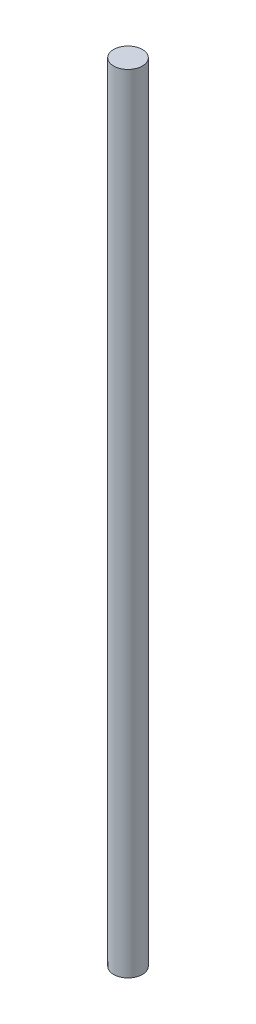
ISO-10303-21;
HEADER;
FILE_DESCRIPTION(('STEP AP214'),'2;1');
FILE_NAME('part.step','',(''),(''),'','','');
FILE_SCHEMA(('AUTOMOTIVE_DESIGN { 1 0 10303 214 1 1 1 1 }'));
ENDSEC;
DATA;
#1=APPLICATION_CONTEXT('core data for automotive mechanical design processes');
#2=APPLICATION_PROTOCOL_DEFINITION('international standard','automotive_design',2000,#1);
#3=PRODUCT_CONTEXT('',#1,'mechanical');
#4=PRODUCT('Part','Part','',(#3));
#5=PRODUCT_RELATED_PRODUCT_CATEGORY('part','',(#4));
#6=PRODUCT_DEFINITION_FORMATION('','',#4);
#7=PRODUCT_DEFINITION_CONTEXT('part definition',#1,'design');
#8=PRODUCT_DEFINITION('design','',#6,#7);
#9=PRODUCT_DEFINITION_SHAPE('','',#8);
#10=(LENGTH_UNIT() NAMED_UNIT(*) SI_UNIT(.MILLI.,.METRE.));
#11=(NAMED_UNIT(*) PLANE_ANGLE_UNIT() SI_UNIT($,.RADIAN.));
#12=(NAMED_UNIT(*) SI_UNIT($,.STERADIAN.) SOLID_ANGLE_UNIT());
#13=UNCERTAINTY_MEASURE_WITH_UNIT(LENGTH_MEASURE(1.E-05),#10,'distance_accuracy_value','');
#14=(GEOMETRIC_REPRESENTATION_CONTEXT(3) GLOBAL_UNCERTAINTY_ASSIGNED_CONTEXT((#13)) GLOBAL_UNIT_ASSIGNED_CONTEXT((#10,
#11,#12)) REPRESENTATION_CONTEXT('',''));
#15=CARTESIAN_POINT('',(0.,0.,0.));
#16=DIRECTION('',(0.,0.,1.));
#17=DIRECTION('',(1.,0.,0.));
#18=AXIS2_PLACEMENT_3D('',#15,#16,#17);
#19=CARTESIAN_POINT('',(0.,348.00032,0.));
#20=DIRECTION('',(0.,-1.,0.));
#21=DIRECTION('',(0.,0.,-1.));
#22=AXIS2_PLACEMENT_3D('',#19,#20,#21);
#23=CYLINDRICAL_SURFACE('',#22,6.35);
#24=CARTESIAN_POINT('',(0.,348.00032,0.));
#25=DIRECTION('',(0.,1.,0.));
#26=DIRECTION('',(0.,0.,1.));
#27=AXIS2_PLACEMENT_3D('',#24,#25,#26);
#28=CIRCLE('',#27,6.35);
#29=CARTESIAN_POINT('',(0.,348.00032,-6.35));
#30=VERTEX_POINT('',#29);
#31=EDGE_CURVE('E10',#30,#30,#28,.T.);
#32=CARTESIAN_POINT('',(0.,0.,0.));
#33=DIRECTION('',(0.,1.,0.));
#34=DIRECTION('',(0.,0.,1.));
#35=AXIS2_PLACEMENT_3D('',#32,#33,#34);
#36=CIRCLE('',#35,6.35);
#37=CARTESIAN_POINT('',(0.,0.,-6.35));
#38=VERTEX_POINT('',#37);
#39=EDGE_CURVE('E46',#38,#38,#36,.T.);
#40=CARTESIAN_POINT('',(0.,348.00032,-6.35));
#41=CARTESIAN_POINT('',(0.,344.375316666667,-6.35));
#42=CARTESIAN_POINT('',(0.,340.750313333333,-6.35));
#43=CARTESIAN_POINT('',(0.,333.500306666667,-6.35));
#44=CARTESIAN_POINT('',(0.,329.875303333333,-6.35));
#45=CARTESIAN_POINT('',(0.,322.625296666667,-6.35));
#46=CARTESIAN_POINT('',(0.,319.000293333333,-6.35));
#47=CARTESIAN_POINT('',(0.,311.750286666667,-6.35));
#48=CARTESIAN_POINT('',(0.,308.125283333333,-6.35));
#49=CARTESIAN_POINT('',(0.,300.875276666667,-6.35));
#50=CARTESIAN_POINT('',(0.,297.250273333333,-6.35));
#51=CARTESIAN_POINT('',(0.,290.000266666667,-6.35));
#52=CARTESIAN_POINT('',(0.,286.375263333333,-6.35));
#53=CARTESIAN_POINT('',(0.,279.125256666667,-6.35));
#54=CARTESIAN_POINT('',(0.,275.500253333333,-6.35));
#55=CARTESIAN_POINT('',(0.,268.250246666667,-6.35));
#56=CARTESIAN_POINT('',(0.,264.625243333333,-6.35));
#57=CARTESIAN_POINT('',(0.,257.375236666667,-6.35));
#58=CARTESIAN_POINT('',(0.,253.750233333333,-6.35));
#59=CARTESIAN_POINT('',(0.,246.500226666667,-6.35));
#60=CARTESIAN_POINT('',(0.,242.875223333333,-6.35));
#61=CARTESIAN_POINT('',(0.,235.625216666667,-6.35));
#62=CARTESIAN_POINT('',(0.,232.000213333333,-6.35));
#63=CARTESIAN_POINT('',(0.,224.750206666667,-6.35));
#64=CARTESIAN_POINT('',(0.,221.125203333333,-6.35));
#65=CARTESIAN_POINT('',(0.,213.875196666667,-6.35));
#66=CARTESIAN_POINT('',(0.,210.250193333333,-6.35));
#67=CARTESIAN_POINT('',(0.,203.000186666667,-6.35));
#68=CARTESIAN_POINT('',(0.,199.375183333333,-6.35));
#69=CARTESIAN_POINT('',(0.,192.125176666667,-6.35));
#70=CARTESIAN_POINT('',(0.,188.500173333333,-6.35));
#71=CARTESIAN_POINT('',(0.,181.250166666667,-6.35));
#72=CARTESIAN_POINT('',(0.,177.625163333333,-6.35));
#73=CARTESIAN_POINT('',(0.,170.375156666667,-6.35));
#74=CARTESIAN_POINT('',(0.,166.750153333333,-6.35));
#75=CARTESIAN_POINT('',(0.,159.500146666667,-6.35));
#76=CARTESIAN_POINT('',(0.,155.875143333333,-6.35));
#77=CARTESIAN_POINT('',(0.,148.625136666667,-6.35));
#78=CARTESIAN_POINT('',(0.,145.000133333333,-6.35));
#79=CARTESIAN_POINT('',(0.,137.750126666667,-6.35));
#80=CARTESIAN_POINT('',(0.,134.125123333333,-6.35));
#81=CARTESIAN_POINT('',(0.,126.875116666667,-6.35));
#82=CARTESIAN_POINT('',(0.,123.250113333333,-6.35));
#83=CARTESIAN_POINT('',(0.,116.000106666667,-6.35));
#84=CARTESIAN_POINT('',(0.,112.375103333333,-6.35));
#85=CARTESIAN_POINT('',(0.,105.125096666667,-6.35));
#86=CARTESIAN_POINT('',(0.,101.500093333333,-6.35));
#87=CARTESIAN_POINT('',(0.,94.2500866666667,-6.35));
#88=CARTESIAN_POINT('',(0.,90.6250833333333,-6.35));
#89=CARTESIAN_POINT('',(0.,83.3750766666666,-6.35));
#90=CARTESIAN_POINT('',(0.,79.7500733333333,-6.35));
#91=CARTESIAN_POINT('',(0.,72.5000666666666,-6.35));
#92=CARTESIAN_POINT('',(0.,68.8750633333333,-6.35));
#93=CARTESIAN_POINT('',(0.,61.6250566666666,-6.35));
#94=CARTESIAN_POINT('',(0.,58.0000533333333,-6.35));
#95=CARTESIAN_POINT('',(0.,50.7500466666666,-6.35));
#96=CARTESIAN_POINT('',(0.,47.1250433333333,-6.35));
#97=CARTESIAN_POINT('',(0.,39.8750366666666,-6.35));
#98=CARTESIAN_POINT('',(0.,36.2500333333333,-6.35));
#99=CARTESIAN_POINT('',(0.,29.0000266666666,-6.35));
#100=CARTESIAN_POINT('',(0.,25.3750233333333,-6.35));
#101=CARTESIAN_POINT('',(0.,18.1250166666666,-6.35));
#102=CARTESIAN_POINT('',(0.,14.5000133333333,-6.35));
#103=CARTESIAN_POINT('',(0.,7.25000666666662,-6.35));
#104=CARTESIAN_POINT('',(0.,3.62500333333328,-6.35));
#105=CARTESIAN_POINT('',(0.,0.,-6.35));
#106=B_SPLINE_CURVE_WITH_KNOTS('',3,(#40,#41,#42,#43,#44,#45,#46,#47,#48,#49,#50,#51,#52,#53,
#54,#55,#56,#57,#58,#59,#60,#61,#62,#63,#64,#65,#66,#67,#68,#69,#70,#71,#72,#73,#74,#75,#76,#77,
#78,#79,#80,#81,#82,#83,#84,#85,#86,#87,#88,#89,#90,#91,#92,#93,#94,#95,#96,#97,#98,#99,#100,
#101,#102,#103,#104,#105),.UNSPECIFIED.,.F.,.F.,(4,2,2,2,2,2,2,2,2,2,2,2,2,2,2,2,2,2,2,2,2,2,2,
2,2,2,2,2,2,2,2,2,4),(0.,10.87501,21.75002,32.6250300000001,43.50004,54.37505,65.25006,76.12507,
87.00008,97.8750900000001,108.7501,119.62511,130.50012,141.37513,152.25014,163.12515,174.00016,
184.87517,195.75018,206.62519,217.5002,228.37521,239.25022,250.12523,261.00024,271.87525,
282.75026,293.62527,304.50028,315.37529,326.2503,337.12531,348.00032),.UNSPECIFIED.);
#107=EDGE_CURVE('BSEAM43',#30,#38,#106,.T.);
#108=ORIENTED_EDGE('',*,*,#31,.F.);
#109=ORIENTED_EDGE('',*,*,#39,.T.);
#110=ORIENTED_EDGE('',*,*,#107,.T.);
#111=ORIENTED_EDGE('',*,*,#107,.F.);
#112=EDGE_LOOP('',(#108,#110,#109,#111));
#113=FACE_BOUND('',#112,.T.);
#114=ADVANCED_FACE('F43',(#113),#23,.T.);
#115=CARTESIAN_POINT('',(0.,348.00032,0.));
#116=DIRECTION('',(0.,1.,0.));
#117=DIRECTION('',(0.,0.,1.));
#118=AXIS2_PLACEMENT_3D('',#115,#116,#117);
#119=PLANE('',#118);
#120=ORIENTED_EDGE('',*,*,#31,.T.);
#121=EDGE_LOOP('',(#120));
#122=FACE_BOUND('',#121,.T.);
#123=ADVANCED_FACE('F60',(#122),#119,.T.);
#124=CARTESIAN_POINT('',(0.,0.,0.));
#125=DIRECTION('',(0.,1.,0.));
#126=DIRECTION('',(0.,0.,1.));
#127=AXIS2_PLACEMENT_3D('',#124,#125,#126);
#128=PLANE('',#127);
#129=ORIENTED_EDGE('',*,*,#39,.F.);
#130=EDGE_LOOP('',(#129));
#131=FACE_BOUND('',#130,.T.);
#132=ADVANCED_FACE('F58',(#131),#128,.F.);
#133=CLOSED_SHELL('',(#114,#123,#132));
#134=MANIFOLD_SOLID_BREP('B2',#133);
#135=ADVANCED_BREP_SHAPE_REPRESENTATION('',(#18,#134),#14);
#136=SHAPE_DEFINITION_REPRESENTATION(#9,#135);
ENDSEC;
END-ISO-10303-21;
